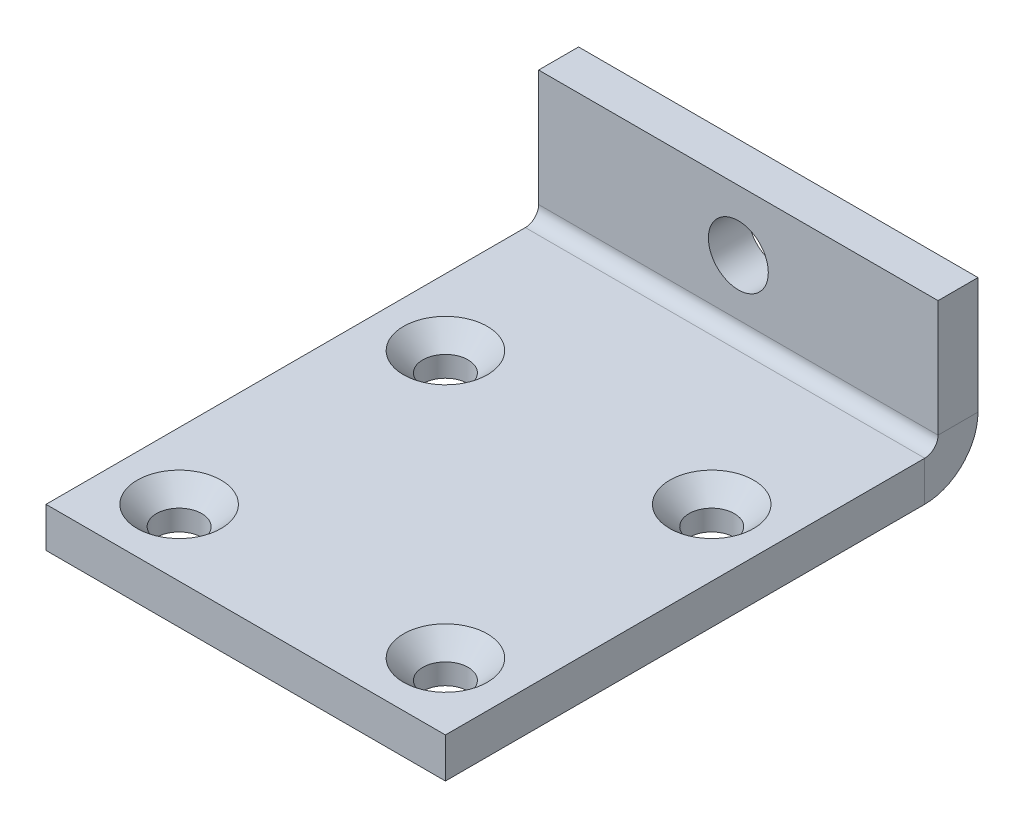
ISO-10303-21;
HEADER;
FILE_DESCRIPTION(('STEP AP214'),'2;1');
FILE_NAME('part.step','',(''),(''),'','','');
FILE_SCHEMA(('AUTOMOTIVE_DESIGN { 1 0 10303 214 1 1 1 1 }'));
ENDSEC;
DATA;
#1=APPLICATION_CONTEXT('core data for automotive mechanical design processes');
#2=APPLICATION_PROTOCOL_DEFINITION('international standard','automotive_design',2000,#1);
#3=PRODUCT_CONTEXT('',#1,'mechanical');
#4=PRODUCT('Part','Part','',(#3));
#5=PRODUCT_RELATED_PRODUCT_CATEGORY('part','',(#4));
#6=PRODUCT_DEFINITION_FORMATION('','',#4);
#7=PRODUCT_DEFINITION_CONTEXT('part definition',#1,'design');
#8=PRODUCT_DEFINITION('design','',#6,#7);
#9=PRODUCT_DEFINITION_SHAPE('','',#8);
#10=(LENGTH_UNIT() NAMED_UNIT(*) SI_UNIT(.MILLI.,.METRE.));
#11=(NAMED_UNIT(*) PLANE_ANGLE_UNIT() SI_UNIT($,.RADIAN.));
#12=(NAMED_UNIT(*) SI_UNIT($,.STERADIAN.) SOLID_ANGLE_UNIT());
#13=UNCERTAINTY_MEASURE_WITH_UNIT(LENGTH_MEASURE(1.E-05),#10,'distance_accuracy_value','');
#14=(GEOMETRIC_REPRESENTATION_CONTEXT(3) GLOBAL_UNCERTAINTY_ASSIGNED_CONTEXT((#13)) GLOBAL_UNIT_ASSIGNED_CONTEXT((#10,
#11,#12)) REPRESENTATION_CONTEXT('',''));
#15=CARTESIAN_POINT('',(0.,0.,0.));
#16=DIRECTION('',(0.,0.,1.));
#17=DIRECTION('',(1.,0.,0.));
#18=AXIS2_PLACEMENT_3D('',#15,#16,#17);
#19=CARTESIAN_POINT('',(30.,0.,4.));
#20=DIRECTION('',(1.,0.,0.));
#21=DIRECTION('',(0.,0.,-1.));
#22=AXIS2_PLACEMENT_3D('',#19,#20,#21);
#23=PLANE('',#22);
#24=DIRECTION('',(0.,1.,0.));
#25=VECTOR('',#24,1.);
#26=CARTESIAN_POINT('',(30.,0.,4.));
#27=LINE('',#26,#25);
#28=CARTESIAN_POINT('',(30.,0.,4.));
#29=VERTEX_POINT('',#28);
#30=CARTESIAN_POINT('',(30.,3.,4.));
#31=VERTEX_POINT('',#30);
#32=EDGE_CURVE('E11',#29,#31,#27,.T.);
#33=ORIENTED_EDGE('',*,*,#32,.F.);
#34=CARTESIAN_POINT('',(30.,4.,4.));
#35=DIRECTION('',(-1.,0.,0.));
#36=DIRECTION('',(0.,0.,1.));
#37=AXIS2_PLACEMENT_3D('',#34,#35,#36);
#38=CIRCLE('',#37,4.);
#39=CARTESIAN_POINT('',(30.,4.,0.));
#40=VERTEX_POINT('',#39);
#41=EDGE_CURVE('E128',#29,#40,#38,.F.);
#42=ORIENTED_EDGE('',*,*,#41,.T.);
#43=DIRECTION('',(0.,0.,-1.));
#44=VECTOR('',#43,1.);
#45=CARTESIAN_POINT('',(30.,4.,3.));
#46=LINE('',#45,#44);
#47=CARTESIAN_POINT('',(30.,4.,3.));
#48=VERTEX_POINT('',#47);
#49=EDGE_CURVE('E46',#48,#40,#46,.T.);
#50=ORIENTED_EDGE('',*,*,#49,.F.);
#51=CARTESIAN_POINT('',(30.,4.,4.));
#52=DIRECTION('',(1.,0.,0.));
#53=DIRECTION('',(0.,0.,-1.));
#54=AXIS2_PLACEMENT_3D('',#51,#52,#53);
#55=CIRCLE('',#54,1.);
#56=EDGE_CURVE('E135',#31,#48,#55,.T.);
#57=ORIENTED_EDGE('',*,*,#56,.F.);
#58=EDGE_LOOP('',(#33,#42,#50,#57));
#59=FACE_BOUND('',#58,.T.);
#60=ADVANCED_FACE('F38',(#59),#23,.T.);
#61=CARTESIAN_POINT('',(30.,4.,3.));
#62=DIRECTION('',(1.,0.,0.));
#63=DIRECTION('',(0.,0.,-1.));
#64=AXIS2_PLACEMENT_3D('',#61,#62,#63);
#65=PLANE('',#64);
#66=DIRECTION('',(0.,0.,-1.));
#67=VECTOR('',#66,1.);
#68=CARTESIAN_POINT('',(30.,0.,0.));
#69=LINE('',#68,#67);
#70=CARTESIAN_POINT('',(30.,0.,40.));
#71=VERTEX_POINT('',#70);
#72=EDGE_CURVE('E123',#71,#29,#69,.T.);
#73=ORIENTED_EDGE('',*,*,#72,.T.);
#74=ORIENTED_EDGE('',*,*,#32,.T.);
#75=DIRECTION('',(0.,0.,-1.));
#76=VECTOR('',#75,1.);
#77=CARTESIAN_POINT('',(30.,3.,0.));
#78=LINE('',#77,#76);
#79=CARTESIAN_POINT('',(30.,3.,40.));
#80=VERTEX_POINT('',#79);
#81=EDGE_CURVE('E133',#80,#31,#78,.T.);
#82=ORIENTED_EDGE('',*,*,#81,.F.);
#83=DIRECTION('',(0.,1.,0.));
#84=VECTOR('',#83,1.);
#85=CARTESIAN_POINT('',(30.,0.,40.));
#86=LINE('',#85,#84);
#87=EDGE_CURVE('E114',#71,#80,#86,.T.);
#88=ORIENTED_EDGE('',*,*,#87,.F.);
#89=EDGE_LOOP('',(#73,#74,#82,#88));
#90=FACE_BOUND('',#89,.T.);
#91=ADVANCED_FACE('F131',(#90),#65,.T.);
#92=CARTESIAN_POINT('',(0.,4.,0.));
#93=DIRECTION('',(-1.,0.,0.));
#94=DIRECTION('',(0.,0.,1.));
#95=AXIS2_PLACEMENT_3D('',#92,#93,#94);
#96=PLANE('',#95);
#97=DIRECTION('',(0.,0.,1.));
#98=VECTOR('',#97,1.);
#99=CARTESIAN_POINT('',(0.,4.,0.));
#100=LINE('',#99,#98);
#101=CARTESIAN_POINT('',(0.,4.,0.));
#102=VERTEX_POINT('',#101);
#103=CARTESIAN_POINT('',(0.,4.,3.));
#104=VERTEX_POINT('',#103);
#105=EDGE_CURVE('E89',#102,#104,#100,.T.);
#106=ORIENTED_EDGE('',*,*,#105,.F.);
#107=CARTESIAN_POINT('',(0.,4.,4.));
#108=DIRECTION('',(-1.,0.,0.));
#109=DIRECTION('',(0.,0.,1.));
#110=AXIS2_PLACEMENT_3D('',#107,#108,#109);
#111=CIRCLE('',#110,4.);
#112=CARTESIAN_POINT('',(0.,0.,4.));
#113=VERTEX_POINT('',#112);
#114=EDGE_CURVE('E158',#113,#102,#111,.F.);
#115=ORIENTED_EDGE('',*,*,#114,.F.);
#116=DIRECTION('',(0.,-1.,0.));
#117=VECTOR('',#116,1.);
#118=CARTESIAN_POINT('',(0.,3.,4.));
#119=LINE('',#118,#117);
#120=CARTESIAN_POINT('',(0.,3.,4.));
#121=VERTEX_POINT('',#120);
#122=EDGE_CURVE('E82',#121,#113,#119,.T.);
#123=ORIENTED_EDGE('',*,*,#122,.F.);
#124=CARTESIAN_POINT('',(0.,4.,4.));
#125=DIRECTION('',(1.,0.,0.));
#126=DIRECTION('',(0.,0.,-1.));
#127=AXIS2_PLACEMENT_3D('',#124,#125,#126);
#128=CIRCLE('',#127,1.);
#129=EDGE_CURVE('E151',#121,#104,#128,.T.);
#130=ORIENTED_EDGE('',*,*,#129,.T.);
#131=EDGE_LOOP('',(#106,#115,#123,#130));
#132=FACE_BOUND('',#131,.T.);
#133=ADVANCED_FACE('F190',(#132),#96,.T.);
#134=CARTESIAN_POINT('',(0.,3.,4.));
#135=DIRECTION('',(-1.,0.,0.));
#136=DIRECTION('',(0.,0.,1.));
#137=AXIS2_PLACEMENT_3D('',#134,#135,#136);
#138=PLANE('',#137);
#139=DIRECTION('',(0.,1.,0.));
#140=VECTOR('',#139,1.);
#141=CARTESIAN_POINT('',(0.,0.,0.));
#142=LINE('',#141,#140);
#143=CARTESIAN_POINT('',(0.,12.75,0.));
#144=VERTEX_POINT('',#143);
#145=EDGE_CURVE('E141',#102,#144,#142,.T.);
#146=ORIENTED_EDGE('',*,*,#145,.F.);
#147=ORIENTED_EDGE('',*,*,#105,.T.);
#148=DIRECTION('',(0.,1.,0.));
#149=VECTOR('',#148,1.);
#150=CARTESIAN_POINT('',(0.,0.,3.));
#151=LINE('',#150,#149);
#152=CARTESIAN_POINT('',(0.,12.75,3.));
#153=VERTEX_POINT('',#152);
#154=EDGE_CURVE('E148',#104,#153,#151,.T.);
#155=ORIENTED_EDGE('',*,*,#154,.T.);
#156=DIRECTION('',(0.,0.,-1.));
#157=VECTOR('',#156,1.);
#158=CARTESIAN_POINT('',(0.,12.75,3.));
#159=LINE('',#158,#157);
#160=EDGE_CURVE('E144',#153,#144,#159,.T.);
#161=ORIENTED_EDGE('',*,*,#160,.T.);
#162=EDGE_LOOP('',(#146,#147,#155,#161));
#163=FACE_BOUND('',#162,.T.);
#164=ADVANCED_FACE('F177',(#163),#138,.T.);
#165=CARTESIAN_POINT('',(30.,0.,0.));
#166=DIRECTION('',(0.,0.,1.));
#167=DIRECTION('',(1.,0.,0.));
#168=AXIS2_PLACEMENT_3D('',#165,#166,#167);
#169=PLANE('',#168);
#170=CARTESIAN_POINT('',(15.,8.2,0.));
#171=DIRECTION('',(0.,0.,1.));
#172=DIRECTION('',(1.,0.,0.));
#173=AXIS2_PLACEMENT_3D('',#170,#171,#172);
#174=CIRCLE('',#173,2.25);
#175=CARTESIAN_POINT('',(17.25,8.2,0.));
#176=VERTEX_POINT('',#175);
#177=EDGE_CURVE('E237',#176,#176,#174,.T.);
#178=ORIENTED_EDGE('',*,*,#177,.T.);
#179=EDGE_LOOP('',(#178));
#180=FACE_BOUND('',#179,.T.);
#181=ORIENTED_EDGE('',*,*,#145,.T.);
#182=DIRECTION('',(-1.,0.,0.));
#183=VECTOR('',#182,1.);
#184=CARTESIAN_POINT('',(30.,12.75,0.));
#185=LINE('',#184,#183);
#186=CARTESIAN_POINT('',(30.,12.75,0.));
#187=VERTEX_POINT('',#186);
#188=EDGE_CURVE('E172',#187,#144,#185,.T.);
#189=ORIENTED_EDGE('',*,*,#188,.F.);
#190=DIRECTION('',(0.,1.,0.));
#191=VECTOR('',#190,1.);
#192=CARTESIAN_POINT('',(30.,0.,0.));
#193=LINE('',#192,#191);
#194=EDGE_CURVE('E95',#40,#187,#193,.T.);
#195=ORIENTED_EDGE('',*,*,#194,.F.);
#196=DIRECTION('',(-1.,0.,0.));
#197=VECTOR('',#196,1.);
#198=CARTESIAN_POINT('',(30.,4.,0.));
#199=LINE('',#198,#197);
#200=EDGE_CURVE('E140',#40,#102,#199,.T.);
#201=ORIENTED_EDGE('',*,*,#200,.T.);
#202=EDGE_LOOP('',(#181,#189,#195,#201));
#203=FACE_BOUND('',#202,.T.);
#204=ADVANCED_FACE('F254',(#180,#203),#169,.F.);
#205=CARTESIAN_POINT('',(30.,12.75,3.));
#206=DIRECTION('',(0.,1.,0.));
#207=DIRECTION('',(0.,0.,1.));
#208=AXIS2_PLACEMENT_3D('',#205,#206,#207);
#209=PLANE('',#208);
#210=ORIENTED_EDGE('',*,*,#160,.F.);
#211=DIRECTION('',(-1.,0.,0.));
#212=VECTOR('',#211,1.);
#213=CARTESIAN_POINT('',(30.,12.75,3.));
#214=LINE('',#213,#212);
#215=CARTESIAN_POINT('',(30.,12.75,3.));
#216=VERTEX_POINT('',#215);
#217=EDGE_CURVE('E170',#216,#153,#214,.T.);
#218=ORIENTED_EDGE('',*,*,#217,.F.);
#219=DIRECTION('',(0.,0.,-1.));
#220=VECTOR('',#219,1.);
#221=CARTESIAN_POINT('',(30.,12.75,3.));
#222=LINE('',#221,#220);
#223=EDGE_CURVE('E196',#216,#187,#222,.T.);
#224=ORIENTED_EDGE('',*,*,#223,.T.);
#225=ORIENTED_EDGE('',*,*,#188,.T.);
#226=EDGE_LOOP('',(#210,#218,#224,#225));
#227=FACE_BOUND('',#226,.T.);
#228=ADVANCED_FACE('F247',(#227),#209,.T.);
#229=CARTESIAN_POINT('',(30.,0.,3.));
#230=DIRECTION('',(0.,0.,1.));
#231=DIRECTION('',(1.,0.,0.));
#232=AXIS2_PLACEMENT_3D('',#229,#230,#231);
#233=PLANE('',#232);
#234=CARTESIAN_POINT('',(15.,8.2,3.));
#235=DIRECTION('',(0.,0.,1.));
#236=DIRECTION('',(1.,0.,0.));
#237=AXIS2_PLACEMENT_3D('',#234,#235,#236);
#238=CIRCLE('',#237,2.25);
#239=CARTESIAN_POINT('',(17.25,8.2,3.));
#240=VERTEX_POINT('',#239);
#241=EDGE_CURVE('E240',#240,#240,#238,.T.);
#242=ORIENTED_EDGE('',*,*,#241,.F.);
#243=EDGE_LOOP('',(#242));
#244=FACE_BOUND('',#243,.T.);
#245=ORIENTED_EDGE('',*,*,#154,.F.);
#246=DIRECTION('',(-1.,0.,0.));
#247=VECTOR('',#246,1.);
#248=CARTESIAN_POINT('',(30.,4.,3.));
#249=LINE('',#248,#247);
#250=EDGE_CURVE('E167',#48,#104,#249,.T.);
#251=ORIENTED_EDGE('',*,*,#250,.F.);
#252=DIRECTION('',(0.,1.,0.));
#253=VECTOR('',#252,1.);
#254=CARTESIAN_POINT('',(30.,0.,3.));
#255=LINE('',#254,#253);
#256=EDGE_CURVE('E195',#48,#216,#255,.T.);
#257=ORIENTED_EDGE('',*,*,#256,.T.);
#258=ORIENTED_EDGE('',*,*,#217,.T.);
#259=EDGE_LOOP('',(#245,#251,#257,#258));
#260=FACE_BOUND('',#259,.T.);
#261=ADVANCED_FACE('F188',(#244,#260),#233,.T.);
#262=CARTESIAN_POINT('',(30.,4.,4.));
#263=DIRECTION('',(-1.,0.,0.));
#264=DIRECTION('',(0.,0.,1.));
#265=AXIS2_PLACEMENT_3D('',#262,#263,#264);
#266=CYLINDRICAL_SURFACE('',#265,1.);
#267=ORIENTED_EDGE('',*,*,#129,.F.);
#268=DIRECTION('',(-1.,0.,0.));
#269=VECTOR('',#268,1.);
#270=CARTESIAN_POINT('',(30.,3.,4.));
#271=LINE('',#270,#269);
#272=EDGE_CURVE('E164',#31,#121,#271,.T.);
#273=ORIENTED_EDGE('',*,*,#272,.F.);
#274=ORIENTED_EDGE('',*,*,#56,.T.);
#275=ORIENTED_EDGE('',*,*,#250,.T.);
#276=EDGE_LOOP('',(#267,#273,#274,#275));
#277=FACE_BOUND('',#276,.T.);
#278=ADVANCED_FACE('F183',(#277),#266,.F.);
#279=CARTESIAN_POINT('',(30.,3.,0.));
#280=DIRECTION('',(0.,1.,0.));
#281=DIRECTION('',(0.,0.,1.));
#282=AXIS2_PLACEMENT_3D('',#279,#280,#281);
#283=PLANE('',#282);
#284=CARTESIAN_POINT('',(5.,3.,35.));
#285=DIRECTION('',(0.,1.,0.));
#286=DIRECTION('',(0.,0.,1.));
#287=AXIS2_PLACEMENT_3D('',#284,#285,#286);
#288=CIRCLE('',#287,3.15);
#289=CARTESIAN_POINT('',(5.,3.,38.15));
#290=VERTEX_POINT('',#289);
#291=EDGE_CURVE('E234',#290,#290,#288,.T.);
#292=ORIENTED_EDGE('',*,*,#291,.F.);
#293=EDGE_LOOP('',(#292));
#294=FACE_BOUND('',#293,.T.);
#295=CARTESIAN_POINT('',(5.,3.,15.));
#296=DIRECTION('',(0.,1.,0.));
#297=DIRECTION('',(0.,0.,1.));
#298=AXIS2_PLACEMENT_3D('',#295,#296,#297);
#299=CIRCLE('',#298,3.15);
#300=CARTESIAN_POINT('',(5.,3.,18.15));
#301=VERTEX_POINT('',#300);
#302=EDGE_CURVE('E225',#301,#301,#299,.T.);
#303=ORIENTED_EDGE('',*,*,#302,.F.);
#304=EDGE_LOOP('',(#303));
#305=FACE_BOUND('',#304,.T.);
#306=CARTESIAN_POINT('',(25.,3.,15.));
#307=DIRECTION('',(0.,1.,0.));
#308=DIRECTION('',(0.,0.,1.));
#309=AXIS2_PLACEMENT_3D('',#306,#307,#308);
#310=CIRCLE('',#309,3.15);
#311=CARTESIAN_POINT('',(25.,3.,18.15));
#312=VERTEX_POINT('',#311);
#313=EDGE_CURVE('E216',#312,#312,#310,.T.);
#314=ORIENTED_EDGE('',*,*,#313,.F.);
#315=EDGE_LOOP('',(#314));
#316=FACE_BOUND('',#315,.T.);
#317=CARTESIAN_POINT('',(25.,3.,35.));
#318=DIRECTION('',(0.,1.,0.));
#319=DIRECTION('',(0.,0.,1.));
#320=AXIS2_PLACEMENT_3D('',#317,#318,#319);
#321=CIRCLE('',#320,3.15);
#322=CARTESIAN_POINT('',(25.,3.,38.15));
#323=VERTEX_POINT('',#322);
#324=EDGE_CURVE('E207',#323,#323,#321,.T.);
#325=ORIENTED_EDGE('',*,*,#324,.F.);
#326=EDGE_LOOP('',(#325));
#327=FACE_BOUND('',#326,.T.);
#328=DIRECTION('',(0.,0.,-1.));
#329=VECTOR('',#328,1.);
#330=CARTESIAN_POINT('',(0.,3.,0.));
#331=LINE('',#330,#329);
#332=CARTESIAN_POINT('',(0.,3.,40.));
#333=VERTEX_POINT('',#332);
#334=EDGE_CURVE('E153',#333,#121,#331,.T.);
#335=ORIENTED_EDGE('',*,*,#334,.F.);
#336=DIRECTION('',(-1.,0.,0.));
#337=VECTOR('',#336,1.);
#338=CARTESIAN_POINT('',(30.,3.,40.));
#339=LINE('',#338,#337);
#340=EDGE_CURVE('E118',#80,#333,#339,.T.);
#341=ORIENTED_EDGE('',*,*,#340,.F.);
#342=ORIENTED_EDGE('',*,*,#81,.T.);
#343=ORIENTED_EDGE('',*,*,#272,.T.);
#344=EDGE_LOOP('',(#335,#341,#342,#343));
#345=FACE_BOUND('',#344,.T.);
#346=ADVANCED_FACE('F193',(#294,#305,#316,#327,#345),#283,.T.);
#347=CARTESIAN_POINT('',(30.,0.,40.));
#348=DIRECTION('',(0.,0.,1.));
#349=DIRECTION('',(1.,0.,0.));
#350=AXIS2_PLACEMENT_3D('',#347,#348,#349);
#351=PLANE('',#350);
#352=DIRECTION('',(0.,1.,0.));
#353=VECTOR('',#352,1.);
#354=CARTESIAN_POINT('',(0.,0.,40.));
#355=LINE('',#354,#353);
#356=CARTESIAN_POINT('',(0.,0.,40.));
#357=VERTEX_POINT('',#356);
#358=EDGE_CURVE('E116',#357,#333,#355,.T.);
#359=ORIENTED_EDGE('',*,*,#358,.F.);
#360=DIRECTION('',(-1.,0.,0.));
#361=VECTOR('',#360,1.);
#362=CARTESIAN_POINT('',(30.,0.,40.));
#363=LINE('',#362,#361);
#364=EDGE_CURVE('E110',#71,#357,#363,.T.);
#365=ORIENTED_EDGE('',*,*,#364,.F.);
#366=ORIENTED_EDGE('',*,*,#87,.T.);
#367=ORIENTED_EDGE('',*,*,#340,.T.);
#368=EDGE_LOOP('',(#359,#365,#366,#367));
#369=FACE_BOUND('',#368,.T.);
#370=ADVANCED_FACE('F112',(#369),#351,.T.);
#371=CARTESIAN_POINT('',(30.,0.,0.));
#372=DIRECTION('',(0.,1.,0.));
#373=DIRECTION('',(0.,0.,1.));
#374=AXIS2_PLACEMENT_3D('',#371,#372,#373);
#375=PLANE('',#374);
#376=CARTESIAN_POINT('',(5.,0.,35.));
#377=DIRECTION('',(0.,1.,0.));
#378=DIRECTION('',(0.,0.,1.));
#379=AXIS2_PLACEMENT_3D('',#376,#377,#378);
#380=CIRCLE('',#379,1.69999999999999);
#381=CARTESIAN_POINT('',(5.,0.,36.7));
#382=VERTEX_POINT('',#381);
#383=EDGE_CURVE('E228',#382,#382,#380,.T.);
#384=ORIENTED_EDGE('',*,*,#383,.T.);
#385=EDGE_LOOP('',(#384));
#386=FACE_BOUND('',#385,.T.);
#387=CARTESIAN_POINT('',(5.,0.,15.));
#388=DIRECTION('',(0.,1.,0.));
#389=DIRECTION('',(0.,0.,1.));
#390=AXIS2_PLACEMENT_3D('',#387,#388,#389);
#391=CIRCLE('',#390,1.69999999999999);
#392=CARTESIAN_POINT('',(5.,0.,16.7));
#393=VERTEX_POINT('',#392);
#394=EDGE_CURVE('E219',#393,#393,#391,.T.);
#395=ORIENTED_EDGE('',*,*,#394,.T.);
#396=EDGE_LOOP('',(#395));
#397=FACE_BOUND('',#396,.T.);
#398=CARTESIAN_POINT('',(25.,0.,15.));
#399=DIRECTION('',(0.,1.,0.));
#400=DIRECTION('',(0.,0.,1.));
#401=AXIS2_PLACEMENT_3D('',#398,#399,#400);
#402=CIRCLE('',#401,1.69999999999999);
#403=CARTESIAN_POINT('',(25.,0.,16.7));
#404=VERTEX_POINT('',#403);
#405=EDGE_CURVE('E210',#404,#404,#402,.T.);
#406=ORIENTED_EDGE('',*,*,#405,.T.);
#407=EDGE_LOOP('',(#406));
#408=FACE_BOUND('',#407,.T.);
#409=CARTESIAN_POINT('',(25.,0.,35.));
#410=DIRECTION('',(0.,1.,0.));
#411=DIRECTION('',(0.,0.,1.));
#412=AXIS2_PLACEMENT_3D('',#409,#410,#411);
#413=CIRCLE('',#412,1.69999999999999);
#414=CARTESIAN_POINT('',(25.,0.,36.7));
#415=VERTEX_POINT('',#414);
#416=EDGE_CURVE('E145',#415,#415,#413,.T.);
#417=ORIENTED_EDGE('',*,*,#416,.T.);
#418=EDGE_LOOP('',(#417));
#419=FACE_BOUND('',#418,.T.);
#420=DIRECTION('',(0.,0.,-1.));
#421=VECTOR('',#420,1.);
#422=CARTESIAN_POINT('',(0.,0.,0.));
#423=LINE('',#422,#421);
#424=EDGE_CURVE('E156',#357,#113,#423,.T.);
#425=ORIENTED_EDGE('',*,*,#424,.T.);
#426=DIRECTION('',(-1.,0.,0.));
#427=VECTOR('',#426,1.);
#428=CARTESIAN_POINT('',(30.,0.,4.));
#429=LINE('',#428,#427);
#430=EDGE_CURVE('E119',#29,#113,#429,.T.);
#431=ORIENTED_EDGE('',*,*,#430,.F.);
#432=ORIENTED_EDGE('',*,*,#72,.F.);
#433=ORIENTED_EDGE('',*,*,#364,.T.);
#434=EDGE_LOOP('',(#425,#431,#432,#433));
#435=FACE_BOUND('',#434,.T.);
#436=ADVANCED_FACE('F124',(#386,#397,#408,#419,#435),#375,.F.);
#437=CARTESIAN_POINT('',(30.,4.,4.));
#438=DIRECTION('',(-1.,0.,0.));
#439=DIRECTION('',(0.,0.,1.));
#440=AXIS2_PLACEMENT_3D('',#437,#438,#439);
#441=CYLINDRICAL_SURFACE('',#440,4.);
#442=ORIENTED_EDGE('',*,*,#114,.T.);
#443=ORIENTED_EDGE('',*,*,#200,.F.);
#444=ORIENTED_EDGE('',*,*,#41,.F.);
#445=ORIENTED_EDGE('',*,*,#430,.T.);
#446=EDGE_LOOP('',(#442,#443,#444,#445));
#447=FACE_BOUND('',#446,.T.);
#448=ADVANCED_FACE('F278',(#447),#441,.T.);
#449=CARTESIAN_POINT('',(30.,4.,4.));
#450=DIRECTION('',(1.,0.,0.));
#451=DIRECTION('',(0.,0.,-1.));
#452=AXIS2_PLACEMENT_3D('',#449,#450,#451);
#453=PLANE('',#452);
#454=ORIENTED_EDGE('',*,*,#194,.T.);
#455=ORIENTED_EDGE('',*,*,#223,.F.);
#456=ORIENTED_EDGE('',*,*,#256,.F.);
#457=ORIENTED_EDGE('',*,*,#49,.T.);
#458=EDGE_LOOP('',(#454,#455,#456,#457));
#459=FACE_BOUND('',#458,.T.);
#460=ADVANCED_FACE('F275',(#459),#453,.T.);
#461=CARTESIAN_POINT('',(0.,4.,4.));
#462=DIRECTION('',(1.,0.,0.));
#463=DIRECTION('',(0.,0.,-1.));
#464=AXIS2_PLACEMENT_3D('',#461,#462,#463);
#465=PLANE('',#464);
#466=ORIENTED_EDGE('',*,*,#334,.T.);
#467=ORIENTED_EDGE('',*,*,#122,.T.);
#468=ORIENTED_EDGE('',*,*,#424,.F.);
#469=ORIENTED_EDGE('',*,*,#358,.T.);
#470=EDGE_LOOP('',(#466,#467,#468,#469));
#471=FACE_BOUND('',#470,.T.);
#472=ADVANCED_FACE('F277',(#471),#465,.F.);
#473=CARTESIAN_POINT('',(25.,3.,35.));
#474=DIRECTION('',(0.,1.,0.));
#475=DIRECTION('',(0.,0.,1.));
#476=AXIS2_PLACEMENT_3D('',#473,#474,#475);
#477=CYLINDRICAL_SURFACE('',#476,1.69999999999999);
#478=ORIENTED_EDGE('',*,*,#416,.F.);
#479=EDGE_LOOP('',(#478));
#480=FACE_BOUND('',#479,.T.);
#481=CARTESIAN_POINT('',(25.,1.54999999999999,35.));
#482=DIRECTION('',(0.,1.,0.));
#483=DIRECTION('',(0.,0.,1.));
#484=AXIS2_PLACEMENT_3D('',#481,#482,#483);
#485=CIRCLE('',#484,1.69999999999999);
#486=CARTESIAN_POINT('',(25.,1.54999999999999,36.7));
#487=VERTEX_POINT('',#486);
#488=EDGE_CURVE('E204',#487,#487,#485,.T.);
#489=ORIENTED_EDGE('',*,*,#488,.T.);
#490=EDGE_LOOP('',(#489));
#491=FACE_BOUND('',#490,.T.);
#492=ADVANCED_FACE('F284',(#480,#491),#477,.F.);
#493=CARTESIAN_POINT('',(25.,3.,35.));
#494=DIRECTION('',(0.,1.,0.));
#495=DIRECTION('',(0.,0.,1.));
#496=AXIS2_PLACEMENT_3D('',#493,#494,#495);
#497=CONICAL_SURFACE('',#496,3.15,0.78539816339745);
#498=ORIENTED_EDGE('',*,*,#488,.F.);
#499=EDGE_LOOP('',(#498));
#500=FACE_BOUND('',#499,.T.);
#501=ORIENTED_EDGE('',*,*,#324,.T.);
#502=EDGE_LOOP('',(#501));
#503=FACE_BOUND('',#502,.T.);
#504=ADVANCED_FACE('F308',(#500,#503),#497,.F.);
#505=CARTESIAN_POINT('',(25.,3.,15.));
#506=DIRECTION('',(0.,1.,0.));
#507=DIRECTION('',(0.,0.,1.));
#508=AXIS2_PLACEMENT_3D('',#505,#506,#507);
#509=CYLINDRICAL_SURFACE('',#508,1.69999999999999);
#510=ORIENTED_EDGE('',*,*,#405,.F.);
#511=EDGE_LOOP('',(#510));
#512=FACE_BOUND('',#511,.T.);
#513=CARTESIAN_POINT('',(25.,1.54999999999999,15.));
#514=DIRECTION('',(0.,1.,0.));
#515=DIRECTION('',(0.,0.,1.));
#516=AXIS2_PLACEMENT_3D('',#513,#514,#515);
#517=CIRCLE('',#516,1.69999999999999);
#518=CARTESIAN_POINT('',(25.,1.54999999999999,16.7));
#519=VERTEX_POINT('',#518);
#520=EDGE_CURVE('E213',#519,#519,#517,.T.);
#521=ORIENTED_EDGE('',*,*,#520,.T.);
#522=EDGE_LOOP('',(#521));
#523=FACE_BOUND('',#522,.T.);
#524=ADVANCED_FACE('F310',(#512,#523),#509,.F.);
#525=CARTESIAN_POINT('',(25.,3.,15.));
#526=DIRECTION('',(0.,1.,0.));
#527=DIRECTION('',(0.,0.,1.));
#528=AXIS2_PLACEMENT_3D('',#525,#526,#527);
#529=CONICAL_SURFACE('',#528,3.15,0.78539816339745);
#530=ORIENTED_EDGE('',*,*,#520,.F.);
#531=EDGE_LOOP('',(#530));
#532=FACE_BOUND('',#531,.T.);
#533=ORIENTED_EDGE('',*,*,#313,.T.);
#534=EDGE_LOOP('',(#533));
#535=FACE_BOUND('',#534,.T.);
#536=ADVANCED_FACE('F316',(#532,#535),#529,.F.);
#537=CARTESIAN_POINT('',(5.,3.,15.));
#538=DIRECTION('',(0.,1.,0.));
#539=DIRECTION('',(0.,0.,1.));
#540=AXIS2_PLACEMENT_3D('',#537,#538,#539);
#541=CYLINDRICAL_SURFACE('',#540,1.69999999999999);
#542=ORIENTED_EDGE('',*,*,#394,.F.);
#543=EDGE_LOOP('',(#542));
#544=FACE_BOUND('',#543,.T.);
#545=CARTESIAN_POINT('',(5.,1.54999999999999,15.));
#546=DIRECTION('',(0.,1.,0.));
#547=DIRECTION('',(0.,0.,1.));
#548=AXIS2_PLACEMENT_3D('',#545,#546,#547);
#549=CIRCLE('',#548,1.69999999999999);
#550=CARTESIAN_POINT('',(5.,1.54999999999999,16.7));
#551=VERTEX_POINT('',#550);
#552=EDGE_CURVE('E222',#551,#551,#549,.T.);
#553=ORIENTED_EDGE('',*,*,#552,.T.);
#554=EDGE_LOOP('',(#553));
#555=FACE_BOUND('',#554,.T.);
#556=ADVANCED_FACE('F324',(#544,#555),#541,.F.);
#557=CARTESIAN_POINT('',(5.,3.,15.));
#558=DIRECTION('',(0.,1.,0.));
#559=DIRECTION('',(0.,0.,1.));
#560=AXIS2_PLACEMENT_3D('',#557,#558,#559);
#561=CONICAL_SURFACE('',#560,3.15,0.78539816339745);
#562=ORIENTED_EDGE('',*,*,#552,.F.);
#563=EDGE_LOOP('',(#562));
#564=FACE_BOUND('',#563,.T.);
#565=ORIENTED_EDGE('',*,*,#302,.T.);
#566=EDGE_LOOP('',(#565));
#567=FACE_BOUND('',#566,.T.);
#568=ADVANCED_FACE('F328',(#564,#567),#561,.F.);
#569=CARTESIAN_POINT('',(5.,3.,35.));
#570=DIRECTION('',(0.,1.,0.));
#571=DIRECTION('',(0.,0.,1.));
#572=AXIS2_PLACEMENT_3D('',#569,#570,#571);
#573=CYLINDRICAL_SURFACE('',#572,1.69999999999999);
#574=ORIENTED_EDGE('',*,*,#383,.F.);
#575=EDGE_LOOP('',(#574));
#576=FACE_BOUND('',#575,.T.);
#577=CARTESIAN_POINT('',(5.,1.54999999999999,35.));
#578=DIRECTION('',(0.,1.,0.));
#579=DIRECTION('',(0.,0.,1.));
#580=AXIS2_PLACEMENT_3D('',#577,#578,#579);
#581=CIRCLE('',#580,1.69999999999999);
#582=CARTESIAN_POINT('',(5.,1.54999999999999,36.7));
#583=VERTEX_POINT('',#582);
#584=EDGE_CURVE('E231',#583,#583,#581,.T.);
#585=ORIENTED_EDGE('',*,*,#584,.T.);
#586=EDGE_LOOP('',(#585));
#587=FACE_BOUND('',#586,.T.);
#588=ADVANCED_FACE('F332',(#576,#587),#573,.F.);
#589=CARTESIAN_POINT('',(5.,3.,35.));
#590=DIRECTION('',(0.,1.,0.));
#591=DIRECTION('',(0.,0.,1.));
#592=AXIS2_PLACEMENT_3D('',#589,#590,#591);
#593=CONICAL_SURFACE('',#592,3.15,0.78539816339745);
#594=ORIENTED_EDGE('',*,*,#584,.F.);
#595=EDGE_LOOP('',(#594));
#596=FACE_BOUND('',#595,.T.);
#597=ORIENTED_EDGE('',*,*,#291,.T.);
#598=EDGE_LOOP('',(#597));
#599=FACE_BOUND('',#598,.T.);
#600=ADVANCED_FACE('F336',(#596,#599),#593,.F.);
#601=CARTESIAN_POINT('',(15.,8.2,3.));
#602=DIRECTION('',(0.,0.,1.));
#603=DIRECTION('',(1.,0.,0.));
#604=AXIS2_PLACEMENT_3D('',#601,#602,#603);
#605=CYLINDRICAL_SURFACE('',#604,2.25);
#606=ORIENTED_EDGE('',*,*,#177,.F.);
#607=EDGE_LOOP('',(#606));
#608=FACE_BOUND('',#607,.T.);
#609=ORIENTED_EDGE('',*,*,#241,.T.);
#610=EDGE_LOOP('',(#609));
#611=FACE_BOUND('',#610,.T.);
#612=ADVANCED_FACE('F244',(#608,#611),#605,.F.);
#613=CLOSED_SHELL('',(#60,#91,#133,#164,#204,#228,#261,#278,#346,#370,#436,#448,#460,#472,#492,
#504,#524,#536,#556,#568,#588,#600,#612));
#614=MANIFOLD_SOLID_BREP('B2',#613);
#615=ADVANCED_BREP_SHAPE_REPRESENTATION('',(#18,#614),#14);
#616=SHAPE_DEFINITION_REPRESENTATION(#9,#615);
ENDSEC;
END-ISO-10303-21;
